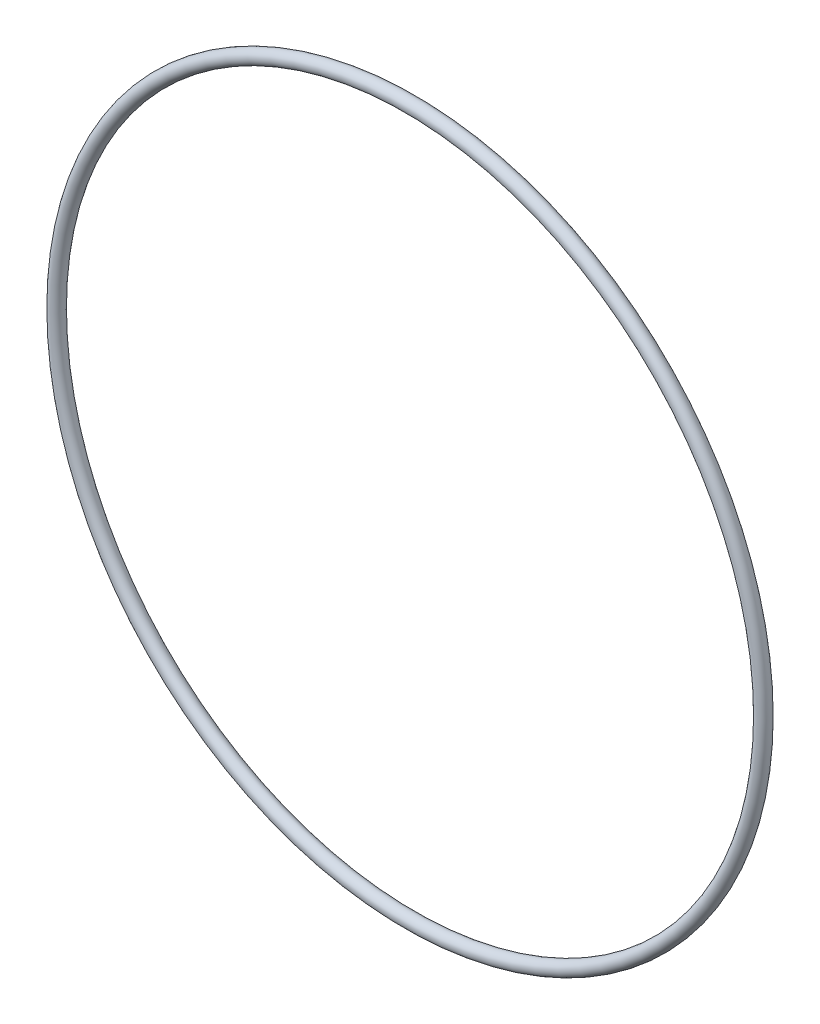
ISO-10303-21;
HEADER;
FILE_DESCRIPTION(('STEP AP214'),'2;1');
FILE_NAME('part.step','',(''),(''),'','','');
FILE_SCHEMA(('AUTOMOTIVE_DESIGN { 1 0 10303 214 1 1 1 1 }'));
ENDSEC;
DATA;
#1=APPLICATION_CONTEXT('core data for automotive mechanical design processes');
#2=APPLICATION_PROTOCOL_DEFINITION('international standard','automotive_design',2000,#1);
#3=PRODUCT_CONTEXT('',#1,'mechanical');
#4=PRODUCT('Part','Part','',(#3));
#5=PRODUCT_RELATED_PRODUCT_CATEGORY('part','',(#4));
#6=PRODUCT_DEFINITION_FORMATION('','',#4);
#7=PRODUCT_DEFINITION_CONTEXT('part definition',#1,'design');
#8=PRODUCT_DEFINITION('design','',#6,#7);
#9=PRODUCT_DEFINITION_SHAPE('','',#8);
#10=(LENGTH_UNIT() NAMED_UNIT(*) SI_UNIT(.MILLI.,.METRE.));
#11=(NAMED_UNIT(*) PLANE_ANGLE_UNIT() SI_UNIT($,.RADIAN.));
#12=(NAMED_UNIT(*) SI_UNIT($,.STERADIAN.) SOLID_ANGLE_UNIT());
#13=UNCERTAINTY_MEASURE_WITH_UNIT(LENGTH_MEASURE(1.E-05),#10,'distance_accuracy_value','');
#14=(GEOMETRIC_REPRESENTATION_CONTEXT(3) GLOBAL_UNCERTAINTY_ASSIGNED_CONTEXT((#13)) GLOBAL_UNIT_ASSIGNED_CONTEXT((#10,
#11,#12)) REPRESENTATION_CONTEXT('',''));
#15=CARTESIAN_POINT('',(0.,0.,0.));
#16=DIRECTION('',(0.,0.,1.));
#17=DIRECTION('',(1.,0.,0.));
#18=AXIS2_PLACEMENT_3D('',#15,#16,#17);
#19=CARTESIAN_POINT('',(0.,0.,0.));
#20=DIRECTION('',(0.,0.,1.));
#21=DIRECTION('',(1.,0.,0.));
#22=AXIS2_PLACEMENT_3D('',#19,#20,#21);
#23=TOROIDAL_SURFACE('',#22,45.1993,0.889000000000003);
#24=CARTESIAN_POINT('',(46.0883,0.,0.));
#25=VERTEX_POINT('',#24);
#26=VERTEX_LOOP('',#25);
#27=FACE_BOUND('',#26,.T.);
#28=ADVANCED_FACE('F28',(#27),#23,.T.);
#29=CLOSED_SHELL('',(#28));
#30=MANIFOLD_SOLID_BREP('B2',#29);
#31=ADVANCED_BREP_SHAPE_REPRESENTATION('',(#18,#30),#14);
#32=SHAPE_DEFINITION_REPRESENTATION(#9,#31);
ENDSEC;
END-ISO-10303-21;
